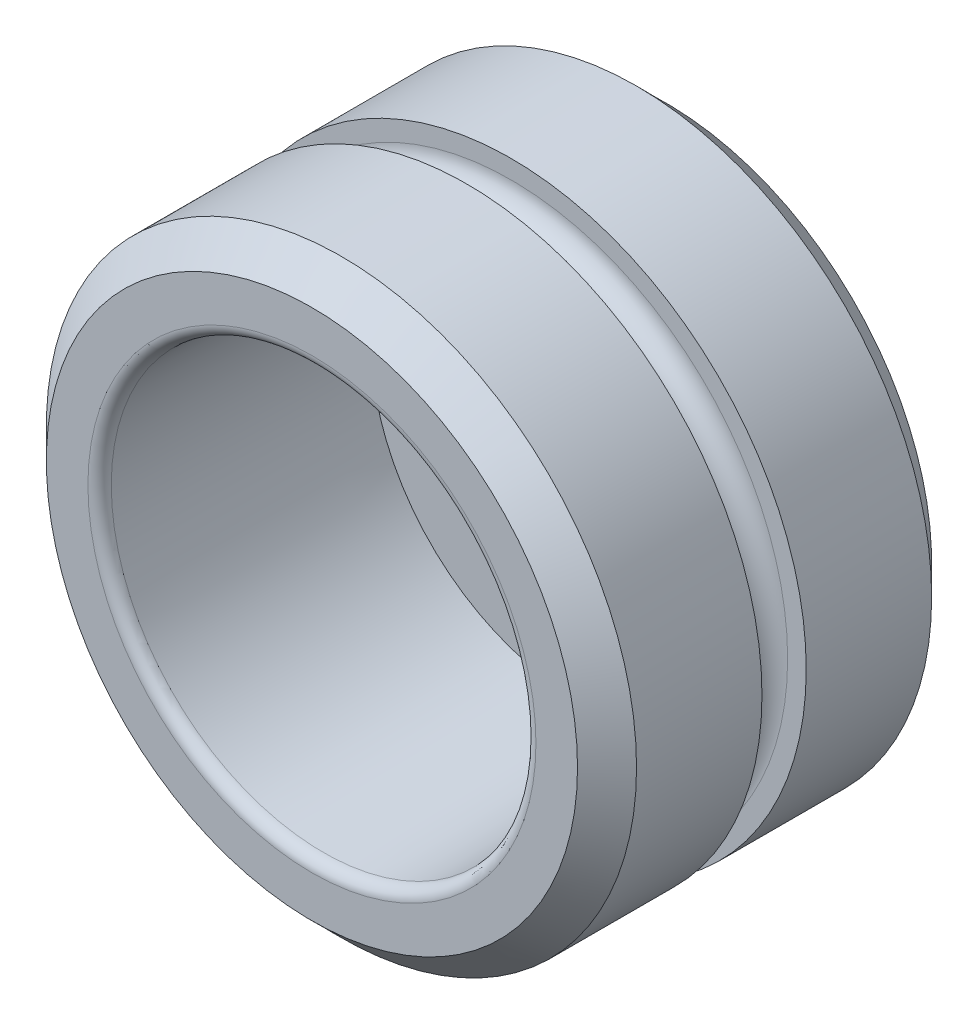
ISO-10303-21;
HEADER;
FILE_DESCRIPTION(('STEP AP214'),'2;1');
FILE_NAME('part.step','',(''),(''),'','','');
FILE_SCHEMA(('AUTOMOTIVE_DESIGN { 1 0 10303 214 1 1 1 1 }'));
ENDSEC;
DATA;
#1=APPLICATION_CONTEXT('core data for automotive mechanical design processes');
#2=APPLICATION_PROTOCOL_DEFINITION('international standard','automotive_design',2000,#1);
#3=PRODUCT_CONTEXT('',#1,'mechanical');
#4=PRODUCT('Part','Part','',(#3));
#5=PRODUCT_RELATED_PRODUCT_CATEGORY('part','',(#4));
#6=PRODUCT_DEFINITION_FORMATION('','',#4);
#7=PRODUCT_DEFINITION_CONTEXT('part definition',#1,'design');
#8=PRODUCT_DEFINITION('design','',#6,#7);
#9=PRODUCT_DEFINITION_SHAPE('','',#8);
#10=(LENGTH_UNIT() NAMED_UNIT(*) SI_UNIT(.MILLI.,.METRE.));
#11=(NAMED_UNIT(*) PLANE_ANGLE_UNIT() SI_UNIT($,.RADIAN.));
#12=(NAMED_UNIT(*) SI_UNIT($,.STERADIAN.) SOLID_ANGLE_UNIT());
#13=UNCERTAINTY_MEASURE_WITH_UNIT(LENGTH_MEASURE(1.E-05),#10,'distance_accuracy_value','');
#14=(GEOMETRIC_REPRESENTATION_CONTEXT(3) GLOBAL_UNCERTAINTY_ASSIGNED_CONTEXT((#13)) GLOBAL_UNIT_ASSIGNED_CONTEXT((#10,
#11,#12)) REPRESENTATION_CONTEXT('',''));
#15=CARTESIAN_POINT('',(0.,0.,0.));
#16=DIRECTION('',(0.,0.,1.));
#17=DIRECTION('',(1.,0.,0.));
#18=AXIS2_PLACEMENT_3D('',#15,#16,#17);
#19=CARTESIAN_POINT('',(7.,0.,2.5));
#20=DIRECTION('',(0.,0.,1.));
#21=DIRECTION('',(1.,0.,0.));
#22=AXIS2_PLACEMENT_3D('',#19,#20,#21);
#23=PLANE('',#22);
#24=CARTESIAN_POINT('',(0.,0.,2.5));
#25=DIRECTION('',(0.,0.,1.));
#26=DIRECTION('',(1.,0.,0.));
#27=AXIS2_PLACEMENT_3D('',#24,#25,#26);
#28=CIRCLE('',#27,7.);
#29=CARTESIAN_POINT('',(7.,0.,2.5));
#30=VERTEX_POINT('',#29);
#31=EDGE_CURVE('E62',#30,#30,#28,.T.);
#32=ORIENTED_EDGE('',*,*,#31,.T.);
#33=EDGE_LOOP('',(#32));
#34=FACE_BOUND('',#33,.T.);
#35=ADVANCED_FACE('F30',(#34),#23,.T.);
#36=CARTESIAN_POINT('',(0.,0.,2.5));
#37=DIRECTION('',(0.,0.,1.));
#38=DIRECTION('',(1.,0.,0.));
#39=AXIS2_PLACEMENT_3D('',#36,#37,#38);
#40=CONICAL_SURFACE('',#39,7.,0.0222185653267192);
#41=CARTESIAN_POINT('',(0.,0.,11.1088866949141));
#42=DIRECTION('',(0.,0.,-1.));
#43=DIRECTION('',(-1.,0.,0.));
#44=AXIS2_PLACEMENT_3D('',#41,#42,#43);
#45=CIRCLE('',#44,7.19130859322031);
#46=CARTESIAN_POINT('',(-7.19130859322031,0.,11.1088866949141));
#47=VERTEX_POINT('',#46);
#48=EDGE_CURVE('E45',#47,#47,#45,.F.);
#49=ORIENTED_EDGE('',*,*,#48,.T.);
#50=EDGE_LOOP('',(#49));
#51=FACE_BOUND('',#50,.T.);
#52=ORIENTED_EDGE('',*,*,#31,.F.);
#53=EDGE_LOOP('',(#52));
#54=FACE_BOUND('',#53,.T.);
#55=ADVANCED_FACE('F97',(#51,#54),#40,.F.);
#56=CARTESIAN_POINT('',(10.,0.,11.5));
#57=DIRECTION('',(0.,0.,1.));
#58=DIRECTION('',(1.,0.,0.));
#59=AXIS2_PLACEMENT_3D('',#56,#57,#58);
#60=PLANE('',#59);
#61=CARTESIAN_POINT('',(0.,0.,11.5));
#62=DIRECTION('',(0.,0.,1.));
#63=DIRECTION('',(1.,0.,0.));
#64=AXIS2_PLACEMENT_3D('',#61,#62,#63);
#65=CIRCLE('',#64,7.59120986435296);
#66=CARTESIAN_POINT('',(7.59120986435296,0.,11.5));
#67=VERTEX_POINT('',#66);
#68=EDGE_CURVE('E41',#67,#67,#65,.F.);
#69=ORIENTED_EDGE('',*,*,#68,.T.);
#70=EDGE_LOOP('',(#69));
#71=FACE_BOUND('',#70,.T.);
#72=CARTESIAN_POINT('',(0.,0.,11.5));
#73=DIRECTION('',(0.,0.,1.));
#74=DIRECTION('',(1.,0.,0.));
#75=AXIS2_PLACEMENT_3D('',#72,#73,#74);
#76=CIRCLE('',#75,9.00000000000001);
#77=CARTESIAN_POINT('',(9.00000000000001,0.,11.5));
#78=VERTEX_POINT('',#77);
#79=EDGE_CURVE('E59',#78,#78,#76,.T.);
#80=ORIENTED_EDGE('',*,*,#79,.T.);
#81=EDGE_LOOP('',(#80));
#82=FACE_BOUND('',#81,.T.);
#83=ADVANCED_FACE('F103',(#71,#82),#60,.T.);
#84=CARTESIAN_POINT('',(0.,0.,2.5));
#85=DIRECTION('',(0.,0.,1.));
#86=DIRECTION('',(1.,0.,0.));
#87=AXIS2_PLACEMENT_3D('',#84,#85,#86);
#88=CYLINDRICAL_SURFACE('',#87,10.);
#89=CARTESIAN_POINT('',(0.,0.,10.5));
#90=DIRECTION('',(0.,0.,1.));
#91=DIRECTION('',(1.,0.,0.));
#92=AXIS2_PLACEMENT_3D('',#89,#90,#91);
#93=CIRCLE('',#92,10.);
#94=CARTESIAN_POINT('',(10.,0.,10.5));
#95=VERTEX_POINT('',#94);
#96=EDGE_CURVE('E56',#95,#95,#93,.F.);
#97=ORIENTED_EDGE('',*,*,#96,.T.);
#98=EDGE_LOOP('',(#97));
#99=FACE_BOUND('',#98,.T.);
#100=CARTESIAN_POINT('',(0.,0.,6.25));
#101=DIRECTION('',(0.,0.,1.));
#102=DIRECTION('',(1.,0.,0.));
#103=AXIS2_PLACEMENT_3D('',#100,#101,#102);
#104=CIRCLE('',#103,10.);
#105=CARTESIAN_POINT('',(10.,0.,6.25));
#106=VERTEX_POINT('',#105);
#107=EDGE_CURVE('E65',#106,#106,#104,.T.);
#108=ORIENTED_EDGE('',*,*,#107,.T.);
#109=EDGE_LOOP('',(#108));
#110=FACE_BOUND('',#109,.T.);
#111=ADVANCED_FACE('F125',(#99,#110),#88,.T.);
#112=CARTESIAN_POINT('',(9.37,0.,6.25));
#113=DIRECTION('',(0.,0.,-1.));
#114=DIRECTION('',(-1.,0.,0.));
#115=AXIS2_PLACEMENT_3D('',#112,#113,#114);
#116=PLANE('',#115);
#117=CARTESIAN_POINT('',(0.,0.,6.25));
#118=DIRECTION('',(0.,0.,1.));
#119=DIRECTION('',(1.,0.,0.));
#120=AXIS2_PLACEMENT_3D('',#117,#118,#119);
#121=CIRCLE('',#120,9.37);
#122=CARTESIAN_POINT('',(9.37,0.,6.25));
#123=VERTEX_POINT('',#122);
#124=EDGE_CURVE('E68',#123,#123,#121,.T.);
#125=ORIENTED_EDGE('',*,*,#124,.T.);
#126=EDGE_LOOP('',(#125));
#127=FACE_BOUND('',#126,.T.);
#128=ORIENTED_EDGE('',*,*,#107,.F.);
#129=EDGE_LOOP('',(#128));
#130=FACE_BOUND('',#129,.T.);
#131=ADVANCED_FACE('F131',(#127,#130),#116,.T.);
#132=CARTESIAN_POINT('',(0.,0.,5.5));
#133=DIRECTION('',(0.,0.,1.));
#134=DIRECTION('',(1.,0.,0.));
#135=AXIS2_PLACEMENT_3D('',#132,#133,#134);
#136=TOROIDAL_SURFACE('',#135,9.37,0.75);
#137=CARTESIAN_POINT('',(0.,0.,4.75));
#138=DIRECTION('',(0.,0.,1.));
#139=DIRECTION('',(1.,0.,0.));
#140=AXIS2_PLACEMENT_3D('',#137,#138,#139);
#141=CIRCLE('',#140,9.37);
#142=CARTESIAN_POINT('',(9.37,0.,4.75));
#143=VERTEX_POINT('',#142);
#144=EDGE_CURVE('E71',#143,#143,#141,.T.);
#145=ORIENTED_EDGE('',*,*,#144,.T.);
#146=EDGE_LOOP('',(#145));
#147=FACE_BOUND('',#146,.T.);
#148=ORIENTED_EDGE('',*,*,#124,.F.);
#149=EDGE_LOOP('',(#148));
#150=FACE_BOUND('',#149,.T.);
#151=ADVANCED_FACE('F137',(#147,#150),#136,.F.);
#152=CARTESIAN_POINT('',(10.,0.,4.75));
#153=DIRECTION('',(0.,0.,1.));
#154=DIRECTION('',(1.,0.,0.));
#155=AXIS2_PLACEMENT_3D('',#152,#153,#154);
#156=PLANE('',#155);
#157=CARTESIAN_POINT('',(0.,0.,4.75));
#158=DIRECTION('',(0.,0.,1.));
#159=DIRECTION('',(1.,0.,0.));
#160=AXIS2_PLACEMENT_3D('',#157,#158,#159);
#161=CIRCLE('',#160,10.);
#162=CARTESIAN_POINT('',(10.,0.,4.75));
#163=VERTEX_POINT('',#162);
#164=EDGE_CURVE('E74',#163,#163,#161,.T.);
#165=ORIENTED_EDGE('',*,*,#164,.T.);
#166=EDGE_LOOP('',(#165));
#167=FACE_BOUND('',#166,.T.);
#168=ORIENTED_EDGE('',*,*,#144,.F.);
#169=EDGE_LOOP('',(#168));
#170=FACE_BOUND('',#169,.T.);
#171=ADVANCED_FACE('F141',(#167,#170),#156,.T.);
#172=CARTESIAN_POINT('',(0.,0.,2.5));
#173=DIRECTION('',(0.,0.,1.));
#174=DIRECTION('',(1.,0.,0.));
#175=AXIS2_PLACEMENT_3D('',#172,#173,#174);
#176=CYLINDRICAL_SURFACE('',#175,10.);
#177=CARTESIAN_POINT('',(0.,0.,0.500000000000001));
#178=DIRECTION('',(0.,0.,-1.));
#179=DIRECTION('',(-1.,0.,0.));
#180=AXIS2_PLACEMENT_3D('',#177,#178,#179);
#181=CIRCLE('',#180,10.);
#182=CARTESIAN_POINT('',(-10.,0.,0.500000000000001));
#183=VERTEX_POINT('',#182);
#184=EDGE_CURVE('E53',#183,#183,#181,.F.);
#185=ORIENTED_EDGE('',*,*,#184,.T.);
#186=EDGE_LOOP('',(#185));
#187=FACE_BOUND('',#186,.T.);
#188=ORIENTED_EDGE('',*,*,#164,.F.);
#189=EDGE_LOOP('',(#188));
#190=FACE_BOUND('',#189,.T.);
#191=ADVANCED_FACE('F145',(#187,#190),#176,.T.);
#192=CARTESIAN_POINT('',(5.89470027858602,0.,-0.5));
#193=DIRECTION('',(0.,0.,-1.));
#194=DIRECTION('',(-1.,0.,0.));
#195=AXIS2_PLACEMENT_3D('',#192,#193,#194);
#196=PLANE('',#195);
#197=CARTESIAN_POINT('',(0.,0.,-0.5));
#198=DIRECTION('',(0.,0.,-1.));
#199=DIRECTION('',(-1.,0.,0.));
#200=AXIS2_PLACEMENT_3D('',#197,#198,#199);
#201=CIRCLE('',#200,5.94659086289058);
#202=CARTESIAN_POINT('',(-5.94659086289058,0.,-0.5));
#203=VERTEX_POINT('',#202);
#204=EDGE_CURVE('E37',#203,#203,#201,.F.);
#205=ORIENTED_EDGE('',*,*,#204,.T.);
#206=EDGE_LOOP('',(#205));
#207=FACE_BOUND('',#206,.T.);
#208=CARTESIAN_POINT('',(0.,0.,-0.5));
#209=DIRECTION('',(0.,0.,-1.));
#210=DIRECTION('',(-1.,0.,0.));
#211=AXIS2_PLACEMENT_3D('',#208,#209,#210);
#212=CIRCLE('',#211,8.99999999999999);
#213=CARTESIAN_POINT('',(-8.99999999999999,0.,-0.5));
#214=VERTEX_POINT('',#213);
#215=EDGE_CURVE('E50',#214,#214,#212,.T.);
#216=ORIENTED_EDGE('',*,*,#215,.T.);
#217=EDGE_LOOP('',(#216));
#218=FACE_BOUND('',#217,.T.);
#219=ADVANCED_FACE('F94',(#207,#218),#196,.T.);
#220=CARTESIAN_POINT('',(0.,0.,-0.5));
#221=DIRECTION('',(0.,0.,-1.));
#222=DIRECTION('',(-1.,0.,0.));
#223=AXIS2_PLACEMENT_3D('',#220,#221,#222);
#224=CONICAL_SURFACE('',#223,5.89470027858602,1.31278432400449);
#225=CARTESIAN_POINT('',(0.,0.,-0.486759657426996));
#226=DIRECTION('',(0.,0.,1.));
#227=DIRECTION('',(1.,0.,0.));
#228=AXIS2_PLACEMENT_3D('',#225,#226,#227);
#229=CIRCLE('',#228,5.84452731706273);
#230=CARTESIAN_POINT('',(5.84452731706273,0.,-0.486759657426996));
#231=VERTEX_POINT('',#230);
#232=EDGE_CURVE('E10',#231,#231,#229,.F.);
#233=ORIENTED_EDGE('',*,*,#232,.T.);
#234=EDGE_LOOP('',(#233));
#235=FACE_BOUND('',#234,.T.);
#236=CARTESIAN_POINT('',(0.,0.,0.));
#237=DIRECTION('',(0.,0.,1.));
#238=DIRECTION('',(1.,0.,0.));
#239=AXIS2_PLACEMENT_3D('',#236,#237,#238);
#240=CIRCLE('',#239,4.);
#241=CARTESIAN_POINT('',(4.,0.,0.));
#242=VERTEX_POINT('',#241);
#243=EDGE_CURVE('E77',#242,#242,#240,.T.);
#244=ORIENTED_EDGE('',*,*,#243,.T.);
#245=EDGE_LOOP('',(#244));
#246=FACE_BOUND('',#245,.T.);
#247=ADVANCED_FACE('F81',(#235,#246),#224,.F.);
#248=CARTESIAN_POINT('',(0.,0.,0.));
#249=DIRECTION('',(0.,0.,-1.));
#250=DIRECTION('',(-1.,0.,0.));
#251=AXIS2_PLACEMENT_3D('',#248,#249,#250);
#252=PLANE('',#251);
#253=ORIENTED_EDGE('',*,*,#243,.F.);
#254=EDGE_LOOP('',(#253));
#255=FACE_BOUND('',#254,.T.);
#256=ADVANCED_FACE('F83',(#255),#252,.T.);
#257=CARTESIAN_POINT('',(0.,0.,11.5));
#258=DIRECTION('',(0.,0.,-1.));
#259=DIRECTION('',(-1.,0.,0.));
#260=AXIS2_PLACEMENT_3D('',#257,#258,#259);
#261=CONICAL_SURFACE('',#260,9.00000000000001,0.785398163397445);
#262=ORIENTED_EDGE('',*,*,#96,.F.);
#263=EDGE_LOOP('',(#262));
#264=FACE_BOUND('',#263,.T.);
#265=ORIENTED_EDGE('',*,*,#79,.F.);
#266=EDGE_LOOP('',(#265));
#267=FACE_BOUND('',#266,.T.);
#268=ADVANCED_FACE('F85',(#264,#267),#261,.T.);
#269=CARTESIAN_POINT('',(0.,0.,0.500000000000001));
#270=DIRECTION('',(0.,0.,1.));
#271=DIRECTION('',(1.,0.,0.));
#272=AXIS2_PLACEMENT_3D('',#269,#270,#271);
#273=CONICAL_SURFACE('',#272,10.,0.785398163397452);
#274=ORIENTED_EDGE('',*,*,#215,.F.);
#275=EDGE_LOOP('',(#274));
#276=FACE_BOUND('',#275,.T.);
#277=ORIENTED_EDGE('',*,*,#184,.F.);
#278=EDGE_LOOP('',(#277));
#279=FACE_BOUND('',#278,.T.);
#280=ADVANCED_FACE('F91',(#276,#279),#273,.T.);
#281=CARTESIAN_POINT('',(0.,0.,11.1));
#282=DIRECTION('',(0.,0.,1.));
#283=DIRECTION('',(1.,0.,0.));
#284=AXIS2_PLACEMENT_3D('',#281,#282,#283);
#285=TOROIDAL_SURFACE('',#284,7.59120986435296,0.4);
#286=ORIENTED_EDGE('',*,*,#68,.F.);
#287=EDGE_LOOP('',(#286));
#288=FACE_BOUND('',#287,.T.);
#289=ORIENTED_EDGE('',*,*,#48,.F.);
#290=EDGE_LOOP('',(#289));
#291=FACE_BOUND('',#290,.T.);
#292=ADVANCED_FACE('F109',(#288,#291),#285,.T.);
#293=CARTESIAN_POINT('',(0.,0.,-0.1));
#294=DIRECTION('',(0.,0.,-1.));
#295=DIRECTION('',(-1.,0.,0.));
#296=AXIS2_PLACEMENT_3D('',#293,#294,#295);
#297=TOROIDAL_SURFACE('',#296,5.94659086289058,0.4);
#298=ORIENTED_EDGE('',*,*,#232,.F.);
#299=EDGE_LOOP('',(#298));
#300=FACE_BOUND('',#299,.T.);
#301=ORIENTED_EDGE('',*,*,#204,.F.);
#302=EDGE_LOOP('',(#301));
#303=FACE_BOUND('',#302,.T.);
#304=ADVANCED_FACE('F32',(#300,#303),#297,.T.);
#305=CLOSED_SHELL('',(#35,#55,#83,#111,#131,#151,#171,#191,#219,#247,#256,#268,#280,#292,#304));
#306=MANIFOLD_SOLID_BREP('B2',#305);
#307=ADVANCED_BREP_SHAPE_REPRESENTATION('',(#18,#306),#14);
#308=SHAPE_DEFINITION_REPRESENTATION(#9,#307);
ENDSEC;
END-ISO-10303-21;
